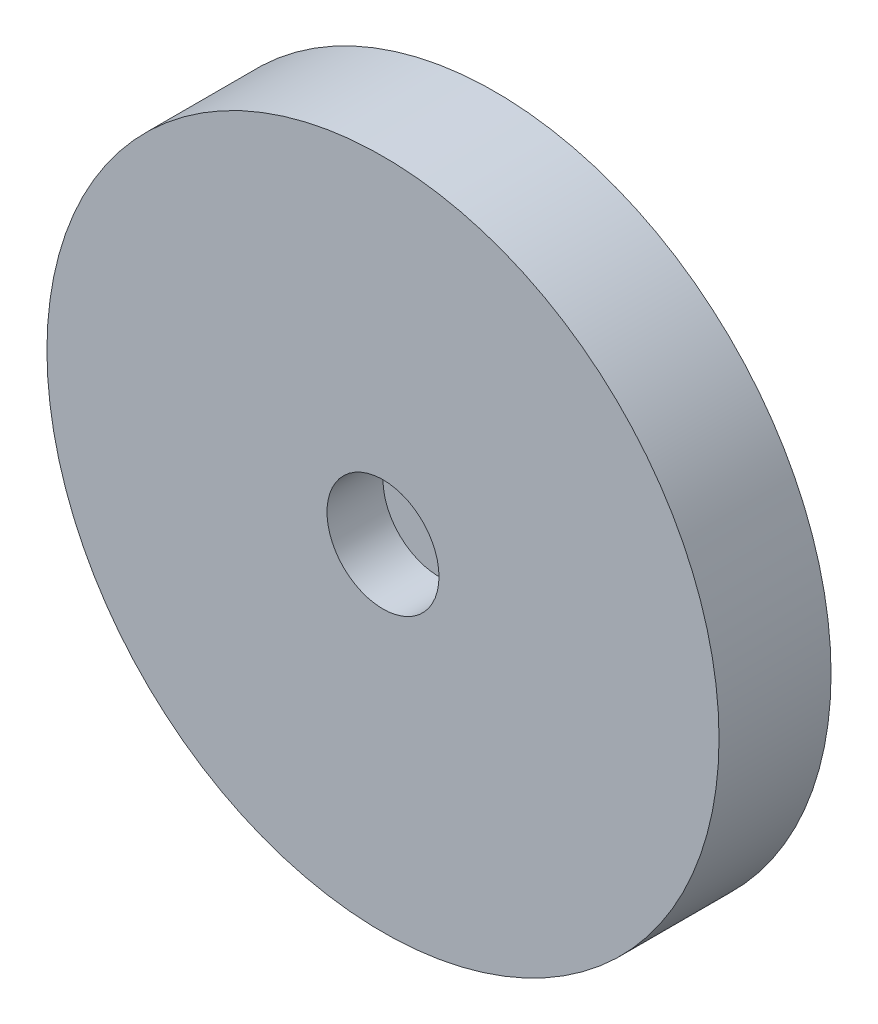
ISO-10303-21;
HEADER;
FILE_DESCRIPTION(('STEP AP214'),'2;1');
FILE_NAME('part.step','',(''),(''),'','','');
FILE_SCHEMA(('AUTOMOTIVE_DESIGN { 1 0 10303 214 1 1 1 1 }'));
ENDSEC;
DATA;
#1=APPLICATION_CONTEXT('core data for automotive mechanical design processes');
#2=APPLICATION_PROTOCOL_DEFINITION('international standard','automotive_design',2000,#1);
#3=PRODUCT_CONTEXT('',#1,'mechanical');
#4=PRODUCT('Part','Part','',(#3));
#5=PRODUCT_RELATED_PRODUCT_CATEGORY('part','',(#4));
#6=PRODUCT_DEFINITION_FORMATION('','',#4);
#7=PRODUCT_DEFINITION_CONTEXT('part definition',#1,'design');
#8=PRODUCT_DEFINITION('design','',#6,#7);
#9=PRODUCT_DEFINITION_SHAPE('','',#8);
#10=(LENGTH_UNIT() NAMED_UNIT(*) SI_UNIT(.MILLI.,.METRE.));
#11=(NAMED_UNIT(*) PLANE_ANGLE_UNIT() SI_UNIT($,.RADIAN.));
#12=(NAMED_UNIT(*) SI_UNIT($,.STERADIAN.) SOLID_ANGLE_UNIT());
#13=UNCERTAINTY_MEASURE_WITH_UNIT(LENGTH_MEASURE(1.E-05),#10,'distance_accuracy_value','');
#14=(GEOMETRIC_REPRESENTATION_CONTEXT(3) GLOBAL_UNCERTAINTY_ASSIGNED_CONTEXT((#13)) GLOBAL_UNIT_ASSIGNED_CONTEXT((#10,
#11,#12)) REPRESENTATION_CONTEXT('',''));
#15=CARTESIAN_POINT('',(0.,0.,0.));
#16=DIRECTION('',(0.,0.,1.));
#17=DIRECTION('',(1.,0.,0.));
#18=AXIS2_PLACEMENT_3D('',#15,#16,#17);
#19=CARTESIAN_POINT('',(0.,0.,50.));
#20=DIRECTION('',(0.,0.,-1.));
#21=DIRECTION('',(-1.,0.,0.));
#22=AXIS2_PLACEMENT_3D('',#19,#20,#21);
#23=CYLINDRICAL_SURFACE('',#22,150.);
#24=CARTESIAN_POINT('',(0.,0.,50.));
#25=DIRECTION('',(0.,0.,1.));
#26=DIRECTION('',(1.,0.,0.));
#27=AXIS2_PLACEMENT_3D('',#24,#25,#26);
#28=CIRCLE('',#27,150.);
#29=CARTESIAN_POINT('',(150.,0.,50.));
#30=VERTEX_POINT('',#29);
#31=EDGE_CURVE('E10',#30,#30,#28,.T.);
#32=ORIENTED_EDGE('',*,*,#31,.F.);
#33=EDGE_LOOP('',(#32));
#34=FACE_BOUND('',#33,.T.);
#35=CARTESIAN_POINT('',(0.,0.,0.));
#36=DIRECTION('',(0.,0.,1.));
#37=DIRECTION('',(1.,0.,0.));
#38=AXIS2_PLACEMENT_3D('',#35,#36,#37);
#39=CIRCLE('',#38,150.);
#40=CARTESIAN_POINT('',(150.,0.,0.));
#41=VERTEX_POINT('',#40);
#42=EDGE_CURVE('E46',#41,#41,#39,.T.);
#43=ORIENTED_EDGE('',*,*,#42,.T.);
#44=EDGE_LOOP('',(#43));
#45=FACE_BOUND('',#44,.T.);
#46=ADVANCED_FACE('F43',(#34,#45),#23,.T.);
#47=CARTESIAN_POINT('',(0.,0.,50.));
#48=DIRECTION('',(0.,0.,1.));
#49=DIRECTION('',(1.,0.,0.));
#50=AXIS2_PLACEMENT_3D('',#47,#48,#49);
#51=PLANE('',#50);
#52=CARTESIAN_POINT('',(0.,0.,50.));
#53=DIRECTION('',(0.,0.,1.));
#54=DIRECTION('',(1.,0.,0.));
#55=AXIS2_PLACEMENT_3D('',#52,#53,#54);
#56=CIRCLE('',#55,25.);
#57=CARTESIAN_POINT('',(25.,0.,50.));
#58=VERTEX_POINT('',#57);
#59=EDGE_CURVE('E60',#58,#58,#56,.T.);
#60=ORIENTED_EDGE('',*,*,#59,.F.);
#61=EDGE_LOOP('',(#60));
#62=FACE_BOUND('',#61,.T.);
#63=ORIENTED_EDGE('',*,*,#31,.T.);
#64=EDGE_LOOP('',(#63));
#65=FACE_BOUND('',#64,.T.);
#66=ADVANCED_FACE('F72',(#62,#65),#51,.T.);
#67=CARTESIAN_POINT('',(0.,0.,0.));
#68=DIRECTION('',(0.,0.,1.));
#69=DIRECTION('',(1.,0.,0.));
#70=AXIS2_PLACEMENT_3D('',#67,#68,#69);
#71=PLANE('',#70);
#72=ORIENTED_EDGE('',*,*,#42,.F.);
#73=EDGE_LOOP('',(#72));
#74=FACE_BOUND('',#73,.T.);
#75=ADVANCED_FACE('F68',(#74),#71,.F.);
#76=CARTESIAN_POINT('',(0.,0.,25.));
#77=DIRECTION('',(0.,0.,1.));
#78=DIRECTION('',(1.,0.,0.));
#79=AXIS2_PLACEMENT_3D('',#76,#77,#78);
#80=CYLINDRICAL_SURFACE('',#79,25.);
#81=CARTESIAN_POINT('',(0.,0.,25.));
#82=DIRECTION('',(0.,0.,1.));
#83=DIRECTION('',(1.,0.,0.));
#84=AXIS2_PLACEMENT_3D('',#81,#82,#83);
#85=CIRCLE('',#84,25.);
#86=CARTESIAN_POINT('',(25.,0.,25.));
#87=VERTEX_POINT('',#86);
#88=EDGE_CURVE('E54',#87,#87,#85,.T.);
#89=ORIENTED_EDGE('',*,*,#88,.F.);
#90=EDGE_LOOP('',(#89));
#91=FACE_BOUND('',#90,.T.);
#92=ORIENTED_EDGE('',*,*,#59,.T.);
#93=EDGE_LOOP('',(#92));
#94=FACE_BOUND('',#93,.T.);
#95=ADVANCED_FACE('F70',(#91,#94),#80,.F.);
#96=CARTESIAN_POINT('',(0.,0.,25.));
#97=DIRECTION('',(0.,0.,1.));
#98=DIRECTION('',(1.,0.,0.));
#99=AXIS2_PLACEMENT_3D('',#96,#97,#98);
#100=PLANE('',#99);
#101=ORIENTED_EDGE('',*,*,#88,.T.);
#102=EDGE_LOOP('',(#101));
#103=FACE_BOUND('',#102,.T.);
#104=ADVANCED_FACE('F64',(#103),#100,.T.);
#105=CLOSED_SHELL('',(#46,#66,#75,#95,#104));
#106=MANIFOLD_SOLID_BREP('B2',#105);
#107=ADVANCED_BREP_SHAPE_REPRESENTATION('',(#18,#106),#14);
#108=SHAPE_DEFINITION_REPRESENTATION(#9,#107);
ENDSEC;
END-ISO-10303-21;
